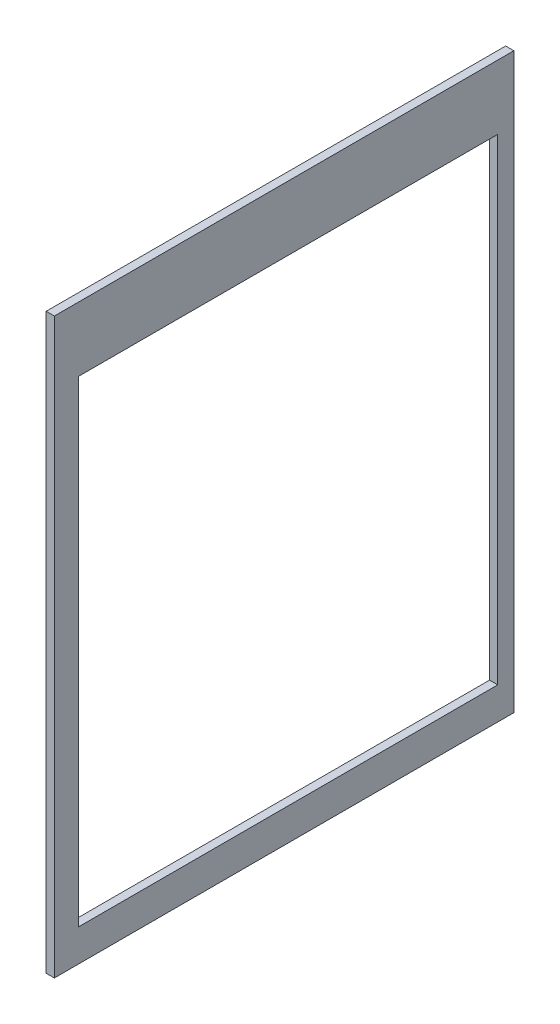
ISO-10303-21;
HEADER;
FILE_DESCRIPTION(('STEP AP214'),'2;1');
FILE_NAME('part.step','',(''),(''),'','','');
FILE_SCHEMA(('AUTOMOTIVE_DESIGN { 1 0 10303 214 1 1 1 1 }'));
ENDSEC;
DATA;
#1=APPLICATION_CONTEXT('core data for automotive mechanical design processes');
#2=APPLICATION_PROTOCOL_DEFINITION('international standard','automotive_design',2000,#1);
#3=PRODUCT_CONTEXT('',#1,'mechanical');
#4=PRODUCT('Part','Part','',(#3));
#5=PRODUCT_RELATED_PRODUCT_CATEGORY('part','',(#4));
#6=PRODUCT_DEFINITION_FORMATION('','',#4);
#7=PRODUCT_DEFINITION_CONTEXT('part definition',#1,'design');
#8=PRODUCT_DEFINITION('design','',#6,#7);
#9=PRODUCT_DEFINITION_SHAPE('','',#8);
#10=(LENGTH_UNIT() NAMED_UNIT(*) SI_UNIT(.MILLI.,.METRE.));
#11=(NAMED_UNIT(*) PLANE_ANGLE_UNIT() SI_UNIT($,.RADIAN.));
#12=(NAMED_UNIT(*) SI_UNIT($,.STERADIAN.) SOLID_ANGLE_UNIT());
#13=UNCERTAINTY_MEASURE_WITH_UNIT(LENGTH_MEASURE(1.E-05),#10,'distance_accuracy_value','');
#14=(GEOMETRIC_REPRESENTATION_CONTEXT(3) GLOBAL_UNCERTAINTY_ASSIGNED_CONTEXT((#13)) GLOBAL_UNIT_ASSIGNED_CONTEXT((#10,
#11,#12)) REPRESENTATION_CONTEXT('',''));
#15=CARTESIAN_POINT('',(0.,0.,0.));
#16=DIRECTION('',(0.,0.,1.));
#17=DIRECTION('',(1.,0.,0.));
#18=AXIS2_PLACEMENT_3D('',#15,#16,#17);
#19=CARTESIAN_POINT('',(5.,0.,0.));
#20=DIRECTION('',(1.,0.,0.));
#21=DIRECTION('',(0.,0.,-1.));
#22=AXIS2_PLACEMENT_3D('',#19,#20,#21);
#23=PLANE('',#22);
#24=DIRECTION('',(0.,-1.,0.));
#25=VECTOR('',#24,1.);
#26=CARTESIAN_POINT('',(5.,326.782544852726,389.321741886419));
#27=LINE('',#26,#25);
#28=CARTESIAN_POINT('',(5.,326.782544852726,389.321741886419));
#29=VERTEX_POINT('',#28);
#30=CARTESIAN_POINT('',(5.,-23.217455147274,389.321741886419));
#31=VERTEX_POINT('',#30);
#32=EDGE_CURVE('E133',#29,#31,#27,.T.);
#33=ORIENTED_EDGE('',*,*,#32,.T.);
#34=DIRECTION('',(0.,0.,-1.));
#35=VECTOR('',#34,1.);
#36=CARTESIAN_POINT('',(5.,-23.217455147274,389.321741886419));
#37=LINE('',#36,#35);
#38=CARTESIAN_POINT('',(5.,-23.217455147274,108.821741886419));
#39=VERTEX_POINT('',#38);
#40=EDGE_CURVE('E136',#31,#39,#37,.T.);
#41=ORIENTED_EDGE('',*,*,#40,.T.);
#42=DIRECTION('',(0.,1.,0.));
#43=VECTOR('',#42,1.);
#44=CARTESIAN_POINT('',(5.,326.782544852726,108.821741886419));
#45=LINE('',#44,#43);
#46=CARTESIAN_POINT('',(5.,326.782544852726,108.821741886419));
#47=VERTEX_POINT('',#46);
#48=EDGE_CURVE('E139',#39,#47,#45,.T.);
#49=ORIENTED_EDGE('',*,*,#48,.T.);
#50=DIRECTION('',(0.,0.,1.));
#51=VECTOR('',#50,1.);
#52=CARTESIAN_POINT('',(5.,326.782544852726,389.321741886419));
#53=LINE('',#52,#51);
#54=EDGE_CURVE('E141',#47,#29,#53,.T.);
#55=ORIENTED_EDGE('',*,*,#54,.T.);
#56=EDGE_LOOP('',(#33,#41,#49,#55));
#57=FACE_BOUND('',#56,.T.);
#58=DIRECTION('',(0.,0.,1.));
#59=VECTOR('',#58,1.);
#60=CARTESIAN_POINT('',(5.,287.483070246771,118.646610537907));
#61=LINE('',#60,#59);
#62=CARTESIAN_POINT('',(5.,287.483070246771,118.646610537907));
#63=VERTEX_POINT('',#62);
#64=CARTESIAN_POINT('',(5.,287.483070246771,374.584438909186));
#65=VERTEX_POINT('',#64);
#66=EDGE_CURVE('E105',#63,#65,#61,.T.);
#67=ORIENTED_EDGE('',*,*,#66,.F.);
#68=DIRECTION('',(0.,1.,0.));
#69=VECTOR('',#68,1.);
#70=CARTESIAN_POINT('',(5.,-3.56771784429681,118.646610537907));
#71=LINE('',#70,#69);
#72=CARTESIAN_POINT('',(5.,-3.56771784429681,118.646610537907));
#73=VERTEX_POINT('',#72);
#74=EDGE_CURVE('E97',#73,#63,#71,.T.);
#75=ORIENTED_EDGE('',*,*,#74,.F.);
#76=DIRECTION('',(0.,0.,-1.));
#77=VECTOR('',#76,1.);
#78=CARTESIAN_POINT('',(5.,-3.56771784429681,118.646610537907));
#79=LINE('',#78,#77);
#80=CARTESIAN_POINT('',(5.,-3.56771784429681,374.584438909186));
#81=VERTEX_POINT('',#80);
#82=EDGE_CURVE('E119',#81,#73,#79,.T.);
#83=ORIENTED_EDGE('',*,*,#82,.F.);
#84=DIRECTION('',(0.,-1.,0.));
#85=VECTOR('',#84,1.);
#86=CARTESIAN_POINT('',(5.,-3.56771784429681,374.584438909186));
#87=LINE('',#86,#85);
#88=EDGE_CURVE('E117',#65,#81,#87,.T.);
#89=ORIENTED_EDGE('',*,*,#88,.F.);
#90=EDGE_LOOP('',(#67,#75,#83,#89));
#91=FACE_BOUND('',#90,.T.);
#92=ADVANCED_FACE('F32',(#57,#91),#23,.T.);
#93=CARTESIAN_POINT('',(0.,0.,0.));
#94=DIRECTION('',(1.,0.,0.));
#95=DIRECTION('',(0.,0.,-1.));
#96=AXIS2_PLACEMENT_3D('',#93,#94,#95);
#97=PLANE('',#96);
#98=DIRECTION('',(0.,-1.,0.));
#99=VECTOR('',#98,1.);
#100=CARTESIAN_POINT('',(0.,326.782544852726,389.321741886419));
#101=LINE('',#100,#99);
#102=CARTESIAN_POINT('',(0.,326.782544852726,389.321741886419));
#103=VERTEX_POINT('',#102);
#104=CARTESIAN_POINT('',(0.,-23.217455147274,389.321741886419));
#105=VERTEX_POINT('',#104);
#106=EDGE_CURVE('E113',#103,#105,#101,.T.);
#107=ORIENTED_EDGE('',*,*,#106,.F.);
#108=DIRECTION('',(0.,0.,1.));
#109=VECTOR('',#108,1.);
#110=CARTESIAN_POINT('',(0.,326.782544852726,389.321741886419));
#111=LINE('',#110,#109);
#112=CARTESIAN_POINT('',(0.,326.782544852726,108.821741886419));
#113=VERTEX_POINT('',#112);
#114=EDGE_CURVE('E137',#113,#103,#111,.T.);
#115=ORIENTED_EDGE('',*,*,#114,.F.);
#116=DIRECTION('',(0.,1.,0.));
#117=VECTOR('',#116,1.);
#118=CARTESIAN_POINT('',(0.,326.782544852726,108.821741886419));
#119=LINE('',#118,#117);
#120=CARTESIAN_POINT('',(0.,-23.217455147274,108.821741886419));
#121=VERTEX_POINT('',#120);
#122=EDGE_CURVE('E148',#121,#113,#119,.T.);
#123=ORIENTED_EDGE('',*,*,#122,.F.);
#124=DIRECTION('',(0.,0.,-1.));
#125=VECTOR('',#124,1.);
#126=CARTESIAN_POINT('',(0.,-23.217455147274,389.321741886419));
#127=LINE('',#126,#125);
#128=EDGE_CURVE('E146',#105,#121,#127,.T.);
#129=ORIENTED_EDGE('',*,*,#128,.F.);
#130=EDGE_LOOP('',(#107,#115,#123,#129));
#131=FACE_BOUND('',#130,.T.);
#132=DIRECTION('',(0.,1.,0.));
#133=VECTOR('',#132,1.);
#134=CARTESIAN_POINT('',(0.,-3.56771784429681,118.646610537907));
#135=LINE('',#134,#133);
#136=CARTESIAN_POINT('',(0.,-3.56771784429681,118.646610537907));
#137=VERTEX_POINT('',#136);
#138=CARTESIAN_POINT('',(0.,287.483070246771,118.646610537907));
#139=VERTEX_POINT('',#138);
#140=EDGE_CURVE('E55',#137,#139,#135,.T.);
#141=ORIENTED_EDGE('',*,*,#140,.T.);
#142=DIRECTION('',(0.,0.,1.));
#143=VECTOR('',#142,1.);
#144=CARTESIAN_POINT('',(0.,287.483070246771,118.646610537907));
#145=LINE('',#144,#143);
#146=CARTESIAN_POINT('',(0.,287.483070246771,374.584438909186));
#147=VERTEX_POINT('',#146);
#148=EDGE_CURVE('E112',#139,#147,#145,.T.);
#149=ORIENTED_EDGE('',*,*,#148,.T.);
#150=DIRECTION('',(0.,-1.,0.));
#151=VECTOR('',#150,1.);
#152=CARTESIAN_POINT('',(0.,-3.56771784429681,374.584438909186));
#153=LINE('',#152,#151);
#154=CARTESIAN_POINT('',(0.,-3.56771784429681,374.584438909186));
#155=VERTEX_POINT('',#154);
#156=EDGE_CURVE('E125',#147,#155,#153,.T.);
#157=ORIENTED_EDGE('',*,*,#156,.T.);
#158=DIRECTION('',(0.,0.,-1.));
#159=VECTOR('',#158,1.);
#160=CARTESIAN_POINT('',(0.,-3.56771784429681,118.646610537907));
#161=LINE('',#160,#159);
#162=EDGE_CURVE('E106',#155,#137,#161,.T.);
#163=ORIENTED_EDGE('',*,*,#162,.T.);
#164=EDGE_LOOP('',(#141,#149,#157,#163));
#165=FACE_BOUND('',#164,.T.);
#166=ADVANCED_FACE('F166',(#131,#165),#97,.F.);
#167=CARTESIAN_POINT('',(5.,326.782544852726,389.321741886419));
#168=DIRECTION('',(0.,0.,-1.));
#169=DIRECTION('',(0.,1.,0.));
#170=AXIS2_PLACEMENT_3D('',#167,#168,#169);
#171=PLANE('',#170);
#172=ORIENTED_EDGE('',*,*,#106,.T.);
#173=DIRECTION('',(-1.,0.,0.));
#174=VECTOR('',#173,1.);
#175=CARTESIAN_POINT('',(5.,-23.217455147274,389.321741886419));
#176=LINE('',#175,#174);
#177=EDGE_CURVE('E11',#31,#105,#176,.T.);
#178=ORIENTED_EDGE('',*,*,#177,.F.);
#179=ORIENTED_EDGE('',*,*,#32,.F.);
#180=DIRECTION('',(-1.,0.,0.));
#181=VECTOR('',#180,1.);
#182=CARTESIAN_POINT('',(5.,326.782544852726,389.321741886419));
#183=LINE('',#182,#181);
#184=EDGE_CURVE('E143',#29,#103,#183,.T.);
#185=ORIENTED_EDGE('',*,*,#184,.T.);
#186=EDGE_LOOP('',(#172,#178,#179,#185));
#187=FACE_BOUND('',#186,.T.);
#188=ADVANCED_FACE('F34',(#187),#171,.F.);
#189=CARTESIAN_POINT('',(5.,-23.217455147274,389.321741886419));
#190=DIRECTION('',(0.,1.,0.));
#191=DIRECTION('',(0.,0.,1.));
#192=AXIS2_PLACEMENT_3D('',#189,#190,#191);
#193=PLANE('',#192);
#194=ORIENTED_EDGE('',*,*,#128,.T.);
#195=DIRECTION('',(-1.,0.,0.));
#196=VECTOR('',#195,1.);
#197=CARTESIAN_POINT('',(5.,-23.217455147274,108.821741886419));
#198=LINE('',#197,#196);
#199=EDGE_CURVE('E40',#39,#121,#198,.T.);
#200=ORIENTED_EDGE('',*,*,#199,.F.);
#201=ORIENTED_EDGE('',*,*,#40,.F.);
#202=ORIENTED_EDGE('',*,*,#177,.T.);
#203=EDGE_LOOP('',(#194,#200,#201,#202));
#204=FACE_BOUND('',#203,.T.);
#205=ADVANCED_FACE('F176',(#204),#193,.F.);
#206=CARTESIAN_POINT('',(5.,326.782544852726,108.821741886419));
#207=DIRECTION('',(0.,0.,1.));
#208=DIRECTION('',(0.,-1.,0.));
#209=AXIS2_PLACEMENT_3D('',#206,#207,#208);
#210=PLANE('',#209);
#211=ORIENTED_EDGE('',*,*,#122,.T.);
#212=DIRECTION('',(-1.,0.,0.));
#213=VECTOR('',#212,1.);
#214=CARTESIAN_POINT('',(5.,326.782544852726,108.821741886419));
#215=LINE('',#214,#213);
#216=EDGE_CURVE('E153',#47,#113,#215,.T.);
#217=ORIENTED_EDGE('',*,*,#216,.F.);
#218=ORIENTED_EDGE('',*,*,#48,.F.);
#219=ORIENTED_EDGE('',*,*,#199,.T.);
#220=EDGE_LOOP('',(#211,#217,#218,#219));
#221=FACE_BOUND('',#220,.T.);
#222=ADVANCED_FACE('F160',(#221),#210,.F.);
#223=CARTESIAN_POINT('',(5.,326.782544852726,389.321741886419));
#224=DIRECTION('',(0.,-1.,0.));
#225=DIRECTION('',(0.,0.,-1.));
#226=AXIS2_PLACEMENT_3D('',#223,#224,#225);
#227=PLANE('',#226);
#228=ORIENTED_EDGE('',*,*,#114,.T.);
#229=ORIENTED_EDGE('',*,*,#184,.F.);
#230=ORIENTED_EDGE('',*,*,#54,.F.);
#231=ORIENTED_EDGE('',*,*,#216,.T.);
#232=EDGE_LOOP('',(#228,#229,#230,#231));
#233=FACE_BOUND('',#232,.T.);
#234=ADVANCED_FACE('F170',(#233),#227,.F.);
#235=CARTESIAN_POINT('',(5.,-3.56771784429681,118.646610537907));
#236=DIRECTION('',(0.,0.,1.));
#237=DIRECTION('',(1.,0.,0.));
#238=AXIS2_PLACEMENT_3D('',#235,#236,#237);
#239=PLANE('',#238);
#240=ORIENTED_EDGE('',*,*,#140,.F.);
#241=DIRECTION('',(-1.,0.,0.));
#242=VECTOR('',#241,1.);
#243=CARTESIAN_POINT('',(5.,-3.56771784429681,118.646610537907));
#244=LINE('',#243,#242);
#245=EDGE_CURVE('E101',#73,#137,#244,.T.);
#246=ORIENTED_EDGE('',*,*,#245,.F.);
#247=ORIENTED_EDGE('',*,*,#74,.T.);
#248=DIRECTION('',(-1.,0.,0.));
#249=VECTOR('',#248,1.);
#250=CARTESIAN_POINT('',(5.,287.483070246771,118.646610537907));
#251=LINE('',#250,#249);
#252=EDGE_CURVE('E100',#63,#139,#251,.T.);
#253=ORIENTED_EDGE('',*,*,#252,.T.);
#254=EDGE_LOOP('',(#240,#246,#247,#253));
#255=FACE_BOUND('',#254,.T.);
#256=ADVANCED_FACE('F99',(#255),#239,.T.);
#257=CARTESIAN_POINT('',(5.,287.483070246771,118.646610537907));
#258=DIRECTION('',(0.,-1.,0.));
#259=DIRECTION('',(0.,0.,-1.));
#260=AXIS2_PLACEMENT_3D('',#257,#258,#259);
#261=PLANE('',#260);
#262=ORIENTED_EDGE('',*,*,#148,.F.);
#263=ORIENTED_EDGE('',*,*,#252,.F.);
#264=ORIENTED_EDGE('',*,*,#66,.T.);
#265=DIRECTION('',(-1.,0.,0.));
#266=VECTOR('',#265,1.);
#267=CARTESIAN_POINT('',(5.,287.483070246771,374.584438909186));
#268=LINE('',#267,#266);
#269=EDGE_CURVE('E114',#65,#147,#268,.T.);
#270=ORIENTED_EDGE('',*,*,#269,.T.);
#271=EDGE_LOOP('',(#262,#263,#264,#270));
#272=FACE_BOUND('',#271,.T.);
#273=ADVANCED_FACE('F109',(#272),#261,.T.);
#274=CARTESIAN_POINT('',(5.,-3.56771784429681,374.584438909186));
#275=DIRECTION('',(0.,0.,-1.));
#276=DIRECTION('',(-1.,0.,0.));
#277=AXIS2_PLACEMENT_3D('',#274,#275,#276);
#278=PLANE('',#277);
#279=ORIENTED_EDGE('',*,*,#156,.F.);
#280=ORIENTED_EDGE('',*,*,#269,.F.);
#281=ORIENTED_EDGE('',*,*,#88,.T.);
#282=DIRECTION('',(-1.,0.,0.));
#283=VECTOR('',#282,1.);
#284=CARTESIAN_POINT('',(5.,-3.56771784429681,374.584438909186));
#285=LINE('',#284,#283);
#286=EDGE_CURVE('E47',#81,#155,#285,.T.);
#287=ORIENTED_EDGE('',*,*,#286,.T.);
#288=EDGE_LOOP('',(#279,#280,#281,#287));
#289=FACE_BOUND('',#288,.T.);
#290=ADVANCED_FACE('F199',(#289),#278,.T.);
#291=CARTESIAN_POINT('',(5.,-3.56771784429681,118.646610537907));
#292=DIRECTION('',(0.,1.,0.));
#293=DIRECTION('',(0.,0.,1.));
#294=AXIS2_PLACEMENT_3D('',#291,#292,#293);
#295=PLANE('',#294);
#296=ORIENTED_EDGE('',*,*,#162,.F.);
#297=ORIENTED_EDGE('',*,*,#286,.F.);
#298=ORIENTED_EDGE('',*,*,#82,.T.);
#299=ORIENTED_EDGE('',*,*,#245,.T.);
#300=EDGE_LOOP('',(#296,#297,#298,#299));
#301=FACE_BOUND('',#300,.T.);
#302=ADVANCED_FACE('F203',(#301),#295,.T.);
#303=CLOSED_SHELL('',(#92,#166,#188,#205,#222,#234,#256,#273,#290,#302));
#304=MANIFOLD_SOLID_BREP('B2',#303);
#305=ADVANCED_BREP_SHAPE_REPRESENTATION('',(#18,#304),#14);
#306=SHAPE_DEFINITION_REPRESENTATION(#9,#305);
ENDSEC;
END-ISO-10303-21;
